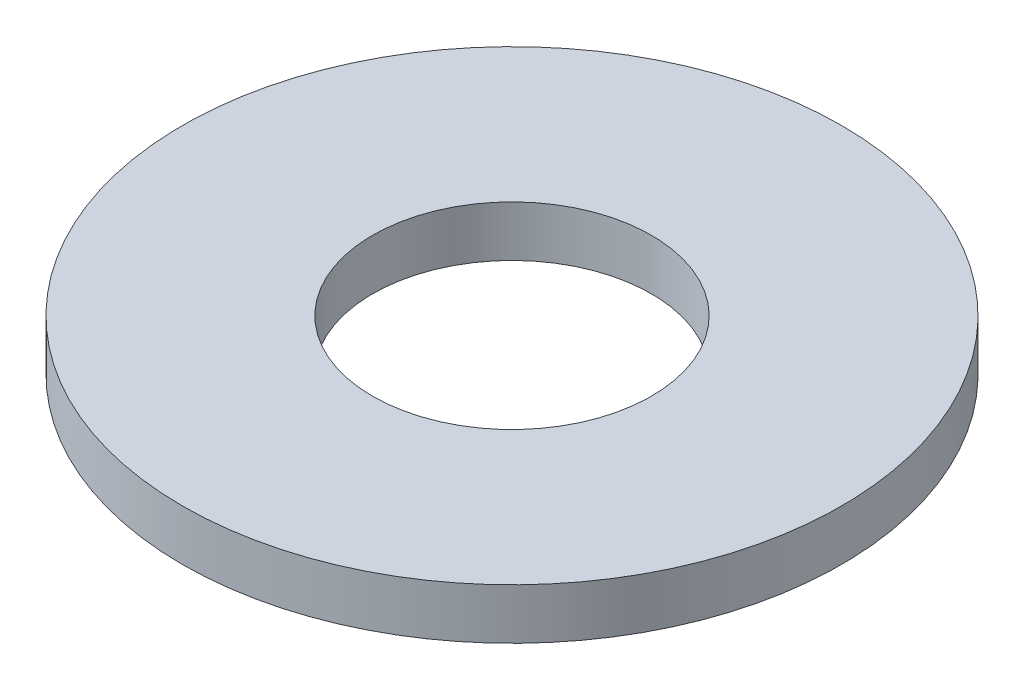
ISO-10303-21;
HEADER;
FILE_DESCRIPTION(('STEP AP214'),'2;1');
FILE_NAME('part.step','',(''),(''),'','','');
FILE_SCHEMA(('AUTOMOTIVE_DESIGN { 1 0 10303 214 1 1 1 1 }'));
ENDSEC;
DATA;
#1=APPLICATION_CONTEXT('core data for automotive mechanical design processes');
#2=APPLICATION_PROTOCOL_DEFINITION('international standard','automotive_design',2000,#1);
#3=PRODUCT_CONTEXT('',#1,'mechanical');
#4=PRODUCT('Part','Part','',(#3));
#5=PRODUCT_RELATED_PRODUCT_CATEGORY('part','',(#4));
#6=PRODUCT_DEFINITION_FORMATION('','',#4);
#7=PRODUCT_DEFINITION_CONTEXT('part definition',#1,'design');
#8=PRODUCT_DEFINITION('design','',#6,#7);
#9=PRODUCT_DEFINITION_SHAPE('','',#8);
#10=(LENGTH_UNIT() NAMED_UNIT(*) SI_UNIT(.MILLI.,.METRE.));
#11=(NAMED_UNIT(*) PLANE_ANGLE_UNIT() SI_UNIT($,.RADIAN.));
#12=(NAMED_UNIT(*) SI_UNIT($,.STERADIAN.) SOLID_ANGLE_UNIT());
#13=UNCERTAINTY_MEASURE_WITH_UNIT(LENGTH_MEASURE(1.E-05),#10,'distance_accuracy_value','');
#14=(GEOMETRIC_REPRESENTATION_CONTEXT(3) GLOBAL_UNCERTAINTY_ASSIGNED_CONTEXT((#13)) GLOBAL_UNIT_ASSIGNED_CONTEXT((#10,
#11,#12)) REPRESENTATION_CONTEXT('',''));
#15=CARTESIAN_POINT('',(0.,0.,0.));
#16=DIRECTION('',(0.,0.,1.));
#17=DIRECTION('',(1.,0.,0.));
#18=AXIS2_PLACEMENT_3D('',#15,#16,#17);
#19=CARTESIAN_POINT('',(0.,2.,0.));
#20=DIRECTION('',(0.,1.,0.));
#21=DIRECTION('',(0.,0.,1.));
#22=AXIS2_PLACEMENT_3D('',#19,#20,#21);
#23=PLANE('',#22);
#24=CARTESIAN_POINT('',(0.,2.,0.));
#25=DIRECTION('',(0.,1.,0.));
#26=DIRECTION('',(0.,0.,1.));
#27=AXIS2_PLACEMENT_3D('',#24,#25,#26);
#28=CIRCLE('',#27,13.);
#29=CARTESIAN_POINT('',(0.,2.,13.));
#30=VERTEX_POINT('',#29);
#31=EDGE_CURVE('E10',#30,#30,#28,.T.);
#32=ORIENTED_EDGE('',*,*,#31,.T.);
#33=EDGE_LOOP('',(#32));
#34=FACE_BOUND('',#33,.T.);
#35=CARTESIAN_POINT('',(0.,2.,0.));
#36=DIRECTION('',(0.,1.,0.));
#37=DIRECTION('',(0.,0.,1.));
#38=AXIS2_PLACEMENT_3D('',#35,#36,#37);
#39=CIRCLE('',#38,5.5);
#40=CARTESIAN_POINT('',(0.,2.,5.5));
#41=VERTEX_POINT('',#40);
#42=EDGE_CURVE('E42',#41,#41,#39,.T.);
#43=ORIENTED_EDGE('',*,*,#42,.F.);
#44=EDGE_LOOP('',(#43));
#45=FACE_BOUND('',#44,.T.);
#46=ADVANCED_FACE('F31',(#34,#45),#23,.T.);
#47=CARTESIAN_POINT('',(0.,0.,0.));
#48=DIRECTION('',(0.,1.,0.));
#49=DIRECTION('',(0.,0.,1.));
#50=AXIS2_PLACEMENT_3D('',#47,#48,#49);
#51=PLANE('',#50);
#52=CARTESIAN_POINT('',(0.,0.,0.));
#53=DIRECTION('',(0.,1.,0.));
#54=DIRECTION('',(0.,0.,1.));
#55=AXIS2_PLACEMENT_3D('',#52,#53,#54);
#56=CIRCLE('',#55,13.);
#57=CARTESIAN_POINT('',(0.,0.,13.));
#58=VERTEX_POINT('',#57);
#59=EDGE_CURVE('E35',#58,#58,#56,.T.);
#60=ORIENTED_EDGE('',*,*,#59,.F.);
#61=EDGE_LOOP('',(#60));
#62=FACE_BOUND('',#61,.T.);
#63=CARTESIAN_POINT('',(0.,0.,0.));
#64=DIRECTION('',(0.,1.,0.));
#65=DIRECTION('',(0.,0.,1.));
#66=AXIS2_PLACEMENT_3D('',#63,#64,#65);
#67=CIRCLE('',#66,5.5);
#68=CARTESIAN_POINT('',(0.,0.,5.5));
#69=VERTEX_POINT('',#68);
#70=EDGE_CURVE('E44',#69,#69,#67,.T.);
#71=ORIENTED_EDGE('',*,*,#70,.T.);
#72=EDGE_LOOP('',(#71));
#73=FACE_BOUND('',#72,.T.);
#74=ADVANCED_FACE('F54',(#62,#73),#51,.F.);
#75=CARTESIAN_POINT('',(0.,2.,0.));
#76=DIRECTION('',(0.,-1.,0.));
#77=DIRECTION('',(0.,0.,-1.));
#78=AXIS2_PLACEMENT_3D('',#75,#76,#77);
#79=CYLINDRICAL_SURFACE('',#78,13.);
#80=ORIENTED_EDGE('',*,*,#31,.F.);
#81=EDGE_LOOP('',(#80));
#82=FACE_BOUND('',#81,.T.);
#83=ORIENTED_EDGE('',*,*,#59,.T.);
#84=EDGE_LOOP('',(#83));
#85=FACE_BOUND('',#84,.T.);
#86=ADVANCED_FACE('F33',(#82,#85),#79,.T.);
#87=CARTESIAN_POINT('',(0.,2.,0.));
#88=DIRECTION('',(0.,-1.,0.));
#89=DIRECTION('',(0.,0.,-1.));
#90=AXIS2_PLACEMENT_3D('',#87,#88,#89);
#91=CYLINDRICAL_SURFACE('',#90,5.5);
#92=ORIENTED_EDGE('',*,*,#42,.T.);
#93=EDGE_LOOP('',(#92));
#94=FACE_BOUND('',#93,.T.);
#95=ORIENTED_EDGE('',*,*,#70,.F.);
#96=EDGE_LOOP('',(#95));
#97=FACE_BOUND('',#96,.T.);
#98=ADVANCED_FACE('F50',(#94,#97),#91,.F.);
#99=CLOSED_SHELL('',(#46,#74,#86,#98));
#100=MANIFOLD_SOLID_BREP('B2',#99);
#101=ADVANCED_BREP_SHAPE_REPRESENTATION('',(#18,#100),#14);
#102=SHAPE_DEFINITION_REPRESENTATION(#9,#101);
ENDSEC;
END-ISO-10303-21;
